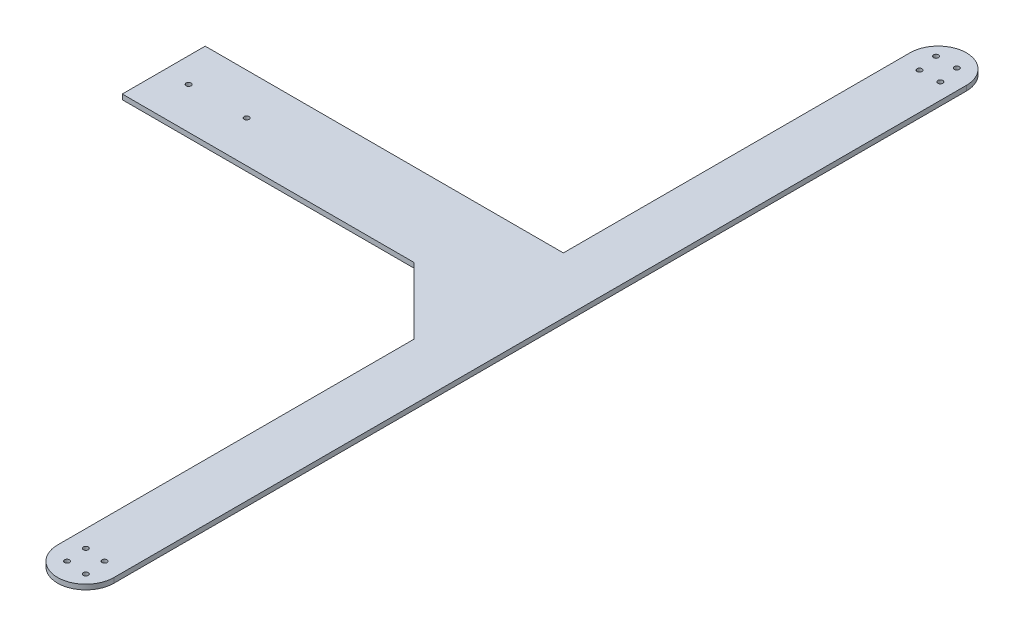
ISO-10303-21;
HEADER;
FILE_DESCRIPTION(('STEP AP214'),'2;1');
FILE_NAME('part.step','',(''),(''),'','','');
FILE_SCHEMA(('AUTOMOTIVE_DESIGN { 1 0 10303 214 1 1 1 1 }'));
ENDSEC;
DATA;
#1=APPLICATION_CONTEXT('core data for automotive mechanical design processes');
#2=APPLICATION_PROTOCOL_DEFINITION('international standard','automotive_design',2000,#1);
#3=PRODUCT_CONTEXT('',#1,'mechanical');
#4=PRODUCT('Part','Part','',(#3));
#5=PRODUCT_RELATED_PRODUCT_CATEGORY('part','',(#4));
#6=PRODUCT_DEFINITION_FORMATION('','',#4);
#7=PRODUCT_DEFINITION_CONTEXT('part definition',#1,'design');
#8=PRODUCT_DEFINITION('design','',#6,#7);
#9=PRODUCT_DEFINITION_SHAPE('','',#8);
#10=(LENGTH_UNIT() NAMED_UNIT(*) SI_UNIT(.MILLI.,.METRE.));
#11=(NAMED_UNIT(*) PLANE_ANGLE_UNIT() SI_UNIT($,.RADIAN.));
#12=(NAMED_UNIT(*) SI_UNIT($,.STERADIAN.) SOLID_ANGLE_UNIT());
#13=UNCERTAINTY_MEASURE_WITH_UNIT(LENGTH_MEASURE(1.E-05),#10,'distance_accuracy_value','');
#14=(GEOMETRIC_REPRESENTATION_CONTEXT(3) GLOBAL_UNCERTAINTY_ASSIGNED_CONTEXT((#13)) GLOBAL_UNIT_ASSIGNED_CONTEXT((#10,
#11,#12)) REPRESENTATION_CONTEXT('',''));
#15=CARTESIAN_POINT('',(0.,0.,0.));
#16=DIRECTION('',(0.,0.,1.));
#17=DIRECTION('',(1.,0.,0.));
#18=AXIS2_PLACEMENT_3D('',#15,#16,#17);
#19=CARTESIAN_POINT('',(233.,3.,-259.060301809058));
#20=DIRECTION('',(0.,-1.,0.));
#21=DIRECTION('',(0.,0.,-1.));
#22=AXIS2_PLACEMENT_3D('',#19,#20,#21);
#23=CYLINDRICAL_SURFACE('',#22,17.);
#24=CARTESIAN_POINT('',(233.,0.,-259.060301809058));
#25=DIRECTION('',(0.,1.,0.));
#26=DIRECTION('',(0.,0.,1.));
#27=AXIS2_PLACEMENT_3D('',#24,#25,#26);
#28=CIRCLE('',#27,17.);
#29=CARTESIAN_POINT('',(216.,0.,-259.060301809058));
#30=VERTEX_POINT('',#29);
#31=CARTESIAN_POINT('',(250.,0.,-259.060301809058));
#32=VERTEX_POINT('',#31);
#33=EDGE_CURVE('E165',#30,#32,#28,.F.);
#34=ORIENTED_EDGE('',*,*,#33,.F.);
#35=DIRECTION('',(0.,-1.,0.));
#36=VECTOR('',#35,1.);
#37=CARTESIAN_POINT('',(216.,3.,-259.060301809058));
#38=LINE('',#37,#36);
#39=CARTESIAN_POINT('',(216.,3.,-259.060301809058));
#40=VERTEX_POINT('',#39);
#41=EDGE_CURVE('E11',#40,#30,#38,.T.);
#42=ORIENTED_EDGE('',*,*,#41,.F.);
#43=CARTESIAN_POINT('',(233.,3.,-259.060301809058));
#44=DIRECTION('',(0.,1.,0.));
#45=DIRECTION('',(0.,0.,1.));
#46=AXIS2_PLACEMENT_3D('',#43,#44,#45);
#47=CIRCLE('',#46,17.);
#48=CARTESIAN_POINT('',(250.,3.,-259.060301809058));
#49=VERTEX_POINT('',#48);
#50=EDGE_CURVE('E503',#40,#49,#47,.F.);
#51=ORIENTED_EDGE('',*,*,#50,.T.);
#52=DIRECTION('',(0.,-1.,0.));
#53=VECTOR('',#52,1.);
#54=CARTESIAN_POINT('',(250.,3.,-259.060301809058));
#55=LINE('',#54,#53);
#56=EDGE_CURVE('E95',#49,#32,#55,.T.);
#57=ORIENTED_EDGE('',*,*,#56,.T.);
#58=EDGE_LOOP('',(#34,#42,#51,#57));
#59=FACE_BOUND('',#58,.T.);
#60=ADVANCED_FACE('F41',(#59),#23,.T.);
#61=CARTESIAN_POINT('',(216.,3.,0.));
#62=DIRECTION('',(-1.,0.,0.));
#63=DIRECTION('',(0.,0.,1.));
#64=AXIS2_PLACEMENT_3D('',#61,#62,#63);
#65=PLANE('',#64);
#66=DIRECTION('',(0.,0.,-1.));
#67=VECTOR('',#66,1.);
#68=CARTESIAN_POINT('',(216.,0.,0.));
#69=LINE('',#68,#67);
#70=CARTESIAN_POINT('',(216.,0.,-50.));
#71=VERTEX_POINT('',#70);
#72=EDGE_CURVE('E163',#71,#30,#69,.T.);
#73=ORIENTED_EDGE('',*,*,#72,.F.);
#74=DIRECTION('',(0.,-1.,0.));
#75=VECTOR('',#74,1.);
#76=CARTESIAN_POINT('',(216.,3.,-50.));
#77=LINE('',#76,#75);
#78=CARTESIAN_POINT('',(216.,3.,-50.));
#79=VERTEX_POINT('',#78);
#80=EDGE_CURVE('E50',#79,#71,#77,.T.);
#81=ORIENTED_EDGE('',*,*,#80,.F.);
#82=DIRECTION('',(0.,0.,-1.));
#83=VECTOR('',#82,1.);
#84=CARTESIAN_POINT('',(216.,3.,0.));
#85=LINE('',#84,#83);
#86=EDGE_CURVE('E499',#79,#40,#85,.T.);
#87=ORIENTED_EDGE('',*,*,#86,.T.);
#88=ORIENTED_EDGE('',*,*,#41,.T.);
#89=EDGE_LOOP('',(#73,#81,#87,#88));
#90=FACE_BOUND('',#89,.T.);
#91=ADVANCED_FACE('F164',(#90),#65,.T.);
#92=CARTESIAN_POINT('',(0.,3.,-50.));
#93=DIRECTION('',(0.,0.,-1.));
#94=DIRECTION('',(-1.,0.,0.));
#95=AXIS2_PLACEMENT_3D('',#92,#93,#94);
#96=PLANE('',#95);
#97=DIRECTION('',(1.,0.,0.));
#98=VECTOR('',#97,1.);
#99=CARTESIAN_POINT('',(0.,0.,-50.));
#100=LINE('',#99,#98);
#101=CARTESIAN_POINT('',(0.,0.,-50.));
#102=VERTEX_POINT('',#101);
#103=EDGE_CURVE('E155',#102,#71,#100,.T.);
#104=ORIENTED_EDGE('',*,*,#103,.F.);
#105=DIRECTION('',(0.,-1.,0.));
#106=VECTOR('',#105,1.);
#107=CARTESIAN_POINT('',(0.,3.,-50.));
#108=LINE('',#107,#106);
#109=CARTESIAN_POINT('',(0.,3.,-50.));
#110=VERTEX_POINT('',#109);
#111=EDGE_CURVE('E148',#110,#102,#108,.T.);
#112=ORIENTED_EDGE('',*,*,#111,.F.);
#113=DIRECTION('',(1.,0.,0.));
#114=VECTOR('',#113,1.);
#115=CARTESIAN_POINT('',(0.,3.,-50.));
#116=LINE('',#115,#114);
#117=EDGE_CURVE('E158',#110,#79,#116,.T.);
#118=ORIENTED_EDGE('',*,*,#117,.T.);
#119=ORIENTED_EDGE('',*,*,#80,.T.);
#120=EDGE_LOOP('',(#104,#112,#118,#119));
#121=FACE_BOUND('',#120,.T.);
#122=ADVANCED_FACE('F153',(#121),#96,.T.);
#123=CARTESIAN_POINT('',(0.,3.,0.));
#124=DIRECTION('',(-1.,0.,0.));
#125=DIRECTION('',(0.,0.,1.));
#126=AXIS2_PLACEMENT_3D('',#123,#124,#125);
#127=PLANE('',#126);
#128=DIRECTION('',(0.,0.,-1.));
#129=VECTOR('',#128,1.);
#130=CARTESIAN_POINT('',(0.,0.,0.));
#131=LINE('',#130,#129);
#132=CARTESIAN_POINT('',(0.,0.,0.));
#133=VERTEX_POINT('',#132);
#134=EDGE_CURVE('E170',#133,#102,#131,.T.);
#135=ORIENTED_EDGE('',*,*,#134,.F.);
#136=DIRECTION('',(0.,-1.,0.));
#137=VECTOR('',#136,1.);
#138=CARTESIAN_POINT('',(0.,3.,0.));
#139=LINE('',#138,#137);
#140=CARTESIAN_POINT('',(0.,3.,0.));
#141=VERTEX_POINT('',#140);
#142=EDGE_CURVE('E146',#141,#133,#139,.T.);
#143=ORIENTED_EDGE('',*,*,#142,.F.);
#144=DIRECTION('',(0.,0.,-1.));
#145=VECTOR('',#144,1.);
#146=CARTESIAN_POINT('',(0.,3.,0.));
#147=LINE('',#146,#145);
#148=EDGE_CURVE('E498',#141,#110,#147,.T.);
#149=ORIENTED_EDGE('',*,*,#148,.T.);
#150=ORIENTED_EDGE('',*,*,#111,.T.);
#151=EDGE_LOOP('',(#135,#143,#149,#150));
#152=FACE_BOUND('',#151,.T.);
#153=ADVANCED_FACE('F316',(#152),#127,.T.);
#154=CARTESIAN_POINT('',(0.,3.,0.));
#155=DIRECTION('',(0.,0.,-1.));
#156=DIRECTION('',(-1.,0.,0.));
#157=AXIS2_PLACEMENT_3D('',#154,#155,#156);
#158=PLANE('',#157);
#159=DIRECTION('',(1.,0.,0.));
#160=VECTOR('',#159,1.);
#161=CARTESIAN_POINT('',(0.,0.,0.));
#162=LINE('',#161,#160);
#163=CARTESIAN_POINT('',(176.,0.,0.));
#164=VERTEX_POINT('',#163);
#165=EDGE_CURVE('E172',#133,#164,#162,.T.);
#166=ORIENTED_EDGE('',*,*,#165,.T.);
#167=DIRECTION('',(0.,-1.,0.));
#168=VECTOR('',#167,1.);
#169=CARTESIAN_POINT('',(176.,3.,0.));
#170=LINE('',#169,#168);
#171=CARTESIAN_POINT('',(176.,3.,0.));
#172=VERTEX_POINT('',#171);
#173=EDGE_CURVE('E139',#172,#164,#170,.T.);
#174=ORIENTED_EDGE('',*,*,#173,.F.);
#175=DIRECTION('',(1.,0.,0.));
#176=VECTOR('',#175,1.);
#177=CARTESIAN_POINT('',(0.,3.,0.));
#178=LINE('',#177,#176);
#179=EDGE_CURVE('E501',#141,#172,#178,.T.);
#180=ORIENTED_EDGE('',*,*,#179,.F.);
#181=ORIENTED_EDGE('',*,*,#142,.T.);
#182=EDGE_LOOP('',(#166,#174,#180,#181));
#183=FACE_BOUND('',#182,.T.);
#184=ADVANCED_FACE('F312',(#183),#158,.F.);
#185=CARTESIAN_POINT('',(88.,3.,-88.));
#186=DIRECTION('',(0.707106781186547,0.,-0.707106781186547));
#187=DIRECTION('',(-0.707106781186548,0.,-0.707106781186548));
#188=AXIS2_PLACEMENT_3D('',#185,#186,#187);
#189=PLANE('',#188);
#190=DIRECTION('',(0.707106781186548,0.,0.707106781186548));
#191=VECTOR('',#190,1.);
#192=CARTESIAN_POINT('',(88.,0.,-88.));
#193=LINE('',#192,#191);
#194=CARTESIAN_POINT('',(216.,0.,40.));
#195=VERTEX_POINT('',#194);
#196=EDGE_CURVE('E178',#164,#195,#193,.T.);
#197=ORIENTED_EDGE('',*,*,#196,.T.);
#198=DIRECTION('',(0.,-1.,0.));
#199=VECTOR('',#198,1.);
#200=CARTESIAN_POINT('',(216.,3.,40.));
#201=LINE('',#200,#199);
#202=CARTESIAN_POINT('',(216.,3.,40.));
#203=VERTEX_POINT('',#202);
#204=EDGE_CURVE('E137',#203,#195,#201,.T.);
#205=ORIENTED_EDGE('',*,*,#204,.F.);
#206=DIRECTION('',(0.707106781186548,0.,0.707106781186548));
#207=VECTOR('',#206,1.);
#208=CARTESIAN_POINT('',(88.,3.,-88.));
#209=LINE('',#208,#207);
#210=EDGE_CURVE('E130',#172,#203,#209,.T.);
#211=ORIENTED_EDGE('',*,*,#210,.F.);
#212=ORIENTED_EDGE('',*,*,#173,.T.);
#213=EDGE_LOOP('',(#197,#205,#211,#212));
#214=FACE_BOUND('',#213,.T.);
#215=ADVANCED_FACE('F309',(#214),#189,.F.);
#216=CARTESIAN_POINT('',(216.,3.,0.));
#217=DIRECTION('',(1.,0.,0.));
#218=DIRECTION('',(0.,0.,-1.));
#219=AXIS2_PLACEMENT_3D('',#216,#217,#218);
#220=PLANE('',#219);
#221=DIRECTION('',(0.,0.,1.));
#222=VECTOR('',#221,1.);
#223=CARTESIAN_POINT('',(216.,0.,0.));
#224=LINE('',#223,#222);
#225=CARTESIAN_POINT('',(216.,0.,255.));
#226=VERTEX_POINT('',#225);
#227=EDGE_CURVE('E136',#195,#226,#224,.T.);
#228=ORIENTED_EDGE('',*,*,#227,.T.);
#229=DIRECTION('',(0.,-1.,0.));
#230=VECTOR('',#229,1.);
#231=CARTESIAN_POINT('',(216.,3.,255.));
#232=LINE('',#231,#230);
#233=CARTESIAN_POINT('',(216.,3.,255.));
#234=VERTEX_POINT('',#233);
#235=EDGE_CURVE('E122',#234,#226,#232,.T.);
#236=ORIENTED_EDGE('',*,*,#235,.F.);
#237=DIRECTION('',(0.,0.,1.));
#238=VECTOR('',#237,1.);
#239=CARTESIAN_POINT('',(216.,3.,0.));
#240=LINE('',#239,#238);
#241=EDGE_CURVE('E125',#203,#234,#240,.T.);
#242=ORIENTED_EDGE('',*,*,#241,.F.);
#243=ORIENTED_EDGE('',*,*,#204,.T.);
#244=EDGE_LOOP('',(#228,#236,#242,#243));
#245=FACE_BOUND('',#244,.T.);
#246=ADVANCED_FACE('F135',(#245),#220,.F.);
#247=CARTESIAN_POINT('',(233.,3.,255.));
#248=DIRECTION('',(0.,-1.,0.));
#249=DIRECTION('',(0.,0.,-1.));
#250=AXIS2_PLACEMENT_3D('',#247,#248,#249);
#251=CYLINDRICAL_SURFACE('',#250,17.);
#252=CARTESIAN_POINT('',(233.,0.,255.));
#253=DIRECTION('',(0.,1.,0.));
#254=DIRECTION('',(0.,0.,1.));
#255=AXIS2_PLACEMENT_3D('',#252,#253,#254);
#256=CIRCLE('',#255,17.);
#257=CARTESIAN_POINT('',(250.,0.,255.));
#258=VERTEX_POINT('',#257);
#259=EDGE_CURVE('E182',#226,#258,#256,.T.);
#260=ORIENTED_EDGE('',*,*,#259,.T.);
#261=DIRECTION('',(0.,-1.,0.));
#262=VECTOR('',#261,1.);
#263=CARTESIAN_POINT('',(250.,3.,255.));
#264=LINE('',#263,#262);
#265=CARTESIAN_POINT('',(250.,3.,255.));
#266=VERTEX_POINT('',#265);
#267=EDGE_CURVE('E124',#266,#258,#264,.T.);
#268=ORIENTED_EDGE('',*,*,#267,.F.);
#269=CARTESIAN_POINT('',(233.,3.,255.));
#270=DIRECTION('',(0.,1.,0.));
#271=DIRECTION('',(0.,0.,1.));
#272=AXIS2_PLACEMENT_3D('',#269,#270,#271);
#273=CIRCLE('',#272,17.);
#274=EDGE_CURVE('E117',#234,#266,#273,.T.);
#275=ORIENTED_EDGE('',*,*,#274,.F.);
#276=ORIENTED_EDGE('',*,*,#235,.T.);
#277=EDGE_LOOP('',(#260,#268,#275,#276));
#278=FACE_BOUND('',#277,.T.);
#279=ADVANCED_FACE('F120',(#278),#251,.T.);
#280=CARTESIAN_POINT('',(238.092169369031,3.,-265.230375643065));
#281=DIRECTION('',(0.,-1.,0.));
#282=DIRECTION('',(0.,0.,-1.));
#283=AXIS2_PLACEMENT_3D('',#280,#281,#282);
#284=CYLINDRICAL_SURFACE('',#283,1.5);
#285=CARTESIAN_POINT('',(238.092169369031,3.,-265.230375643065));
#286=DIRECTION('',(0.,1.,0.));
#287=DIRECTION('',(0.,0.,1.));
#288=AXIS2_PLACEMENT_3D('',#285,#286,#287);
#289=CIRCLE('',#288,1.5);
#290=CARTESIAN_POINT('',(238.092169369031,3.,-263.730375643065));
#291=VERTEX_POINT('',#290);
#292=EDGE_CURVE('E510',#291,#291,#289,.T.);
#293=ORIENTED_EDGE('',*,*,#292,.T.);
#294=EDGE_LOOP('',(#293));
#295=FACE_BOUND('',#294,.T.);
#296=CARTESIAN_POINT('',(238.092169369031,0.,-265.230375643065));
#297=DIRECTION('',(0.,1.,0.));
#298=DIRECTION('',(0.,0.,1.));
#299=AXIS2_PLACEMENT_3D('',#296,#297,#298);
#300=CIRCLE('',#299,1.5);
#301=CARTESIAN_POINT('',(238.092169369031,0.,-263.730375643065));
#302=VERTEX_POINT('',#301);
#303=EDGE_CURVE('E214',#302,#302,#300,.T.);
#304=ORIENTED_EDGE('',*,*,#303,.F.);
#305=EDGE_LOOP('',(#304));
#306=FACE_BOUND('',#305,.T.);
#307=ADVANCED_FACE('F224',(#295,#306),#284,.F.);
#308=CARTESIAN_POINT('',(225.673037322116,3.,-265.107252934781));
#309=DIRECTION('',(0.,-1.,0.));
#310=DIRECTION('',(0.,0.,-1.));
#311=AXIS2_PLACEMENT_3D('',#308,#309,#310);
#312=CYLINDRICAL_SURFACE('',#311,1.5);
#313=CARTESIAN_POINT('',(225.673037322116,3.,-265.107252934781));
#314=DIRECTION('',(0.,1.,0.));
#315=DIRECTION('',(0.,0.,1.));
#316=AXIS2_PLACEMENT_3D('',#313,#314,#315);
#317=CIRCLE('',#316,1.5);
#318=CARTESIAN_POINT('',(225.673037322116,3.,-263.607252934781));
#319=VERTEX_POINT('',#318);
#320=EDGE_CURVE('E513',#319,#319,#317,.T.);
#321=ORIENTED_EDGE('',*,*,#320,.T.);
#322=EDGE_LOOP('',(#321));
#323=FACE_BOUND('',#322,.T.);
#324=CARTESIAN_POINT('',(225.673037322116,0.,-265.107252934781));
#325=DIRECTION('',(0.,1.,0.));
#326=DIRECTION('',(0.,0.,1.));
#327=AXIS2_PLACEMENT_3D('',#324,#325,#326);
#328=CIRCLE('',#327,1.5);
#329=CARTESIAN_POINT('',(225.673037322116,0.,-263.607252934781));
#330=VERTEX_POINT('',#329);
#331=EDGE_CURVE('E211',#330,#330,#328,.T.);
#332=ORIENTED_EDGE('',*,*,#331,.F.);
#333=EDGE_LOOP('',(#332));
#334=FACE_BOUND('',#333,.T.);
#335=ADVANCED_FACE('F227',(#323,#334),#312,.F.);
#336=CARTESIAN_POINT('',(227.90783063097,3.,-252.89022797505));
#337=DIRECTION('',(0.,-1.,0.));
#338=DIRECTION('',(0.,0.,-1.));
#339=AXIS2_PLACEMENT_3D('',#336,#337,#338);
#340=CYLINDRICAL_SURFACE('',#339,1.5);
#341=CARTESIAN_POINT('',(227.90783063097,3.,-252.89022797505));
#342=DIRECTION('',(0.,1.,0.));
#343=DIRECTION('',(0.,0.,1.));
#344=AXIS2_PLACEMENT_3D('',#341,#342,#343);
#345=CIRCLE('',#344,1.5);
#346=CARTESIAN_POINT('',(227.90783063097,3.,-251.39022797505));
#347=VERTEX_POINT('',#346);
#348=EDGE_CURVE('E516',#347,#347,#345,.T.);
#349=ORIENTED_EDGE('',*,*,#348,.T.);
#350=EDGE_LOOP('',(#349));
#351=FACE_BOUND('',#350,.T.);
#352=CARTESIAN_POINT('',(227.90783063097,0.,-252.89022797505));
#353=DIRECTION('',(0.,1.,0.));
#354=DIRECTION('',(0.,0.,1.));
#355=AXIS2_PLACEMENT_3D('',#352,#353,#354);
#356=CIRCLE('',#355,1.5);
#357=CARTESIAN_POINT('',(227.90783063097,0.,-251.39022797505));
#358=VERTEX_POINT('',#357);
#359=EDGE_CURVE('E208',#358,#358,#356,.T.);
#360=ORIENTED_EDGE('',*,*,#359,.F.);
#361=EDGE_LOOP('',(#360));
#362=FACE_BOUND('',#361,.T.);
#363=ADVANCED_FACE('F231',(#351,#362),#340,.F.);
#364=CARTESIAN_POINT('',(240.326962677884,3.,-253.013350683334));
#365=DIRECTION('',(0.,-1.,0.));
#366=DIRECTION('',(0.,0.,-1.));
#367=AXIS2_PLACEMENT_3D('',#364,#365,#366);
#368=CYLINDRICAL_SURFACE('',#367,1.5);
#369=CARTESIAN_POINT('',(240.326962677884,3.,-253.013350683334));
#370=DIRECTION('',(0.,1.,0.));
#371=DIRECTION('',(0.,0.,1.));
#372=AXIS2_PLACEMENT_3D('',#369,#370,#371);
#373=CIRCLE('',#372,1.5);
#374=CARTESIAN_POINT('',(240.326962677884,3.,-251.513350683334));
#375=VERTEX_POINT('',#374);
#376=EDGE_CURVE('E519',#375,#375,#373,.T.);
#377=ORIENTED_EDGE('',*,*,#376,.T.);
#378=EDGE_LOOP('',(#377));
#379=FACE_BOUND('',#378,.T.);
#380=CARTESIAN_POINT('',(240.326962677884,0.,-253.013350683334));
#381=DIRECTION('',(0.,1.,0.));
#382=DIRECTION('',(0.,0.,1.));
#383=AXIS2_PLACEMENT_3D('',#380,#381,#382);
#384=CIRCLE('',#383,1.5);
#385=CARTESIAN_POINT('',(240.326962677884,0.,-251.513350683334));
#386=VERTEX_POINT('',#385);
#387=EDGE_CURVE('E205',#386,#386,#384,.T.);
#388=ORIENTED_EDGE('',*,*,#387,.F.);
#389=EDGE_LOOP('',(#388));
#390=FACE_BOUND('',#389,.T.);
#391=ADVANCED_FACE('F235',(#379,#390),#368,.F.);
#392=CARTESIAN_POINT('',(226.282485578728,3.,248.282485578728));
#393=DIRECTION('',(0.,-1.,0.));
#394=DIRECTION('',(0.,0.,-1.));
#395=AXIS2_PLACEMENT_3D('',#392,#393,#394);
#396=CYLINDRICAL_SURFACE('',#395,1.5);
#397=CARTESIAN_POINT('',(226.282485578728,3.,248.282485578728));
#398=DIRECTION('',(0.,1.,0.));
#399=DIRECTION('',(0.,0.,1.));
#400=AXIS2_PLACEMENT_3D('',#397,#398,#399);
#401=CIRCLE('',#400,1.5);
#402=CARTESIAN_POINT('',(226.282485578728,3.,249.782485578728));
#403=VERTEX_POINT('',#402);
#404=EDGE_CURVE('E522',#403,#403,#401,.T.);
#405=ORIENTED_EDGE('',*,*,#404,.T.);
#406=EDGE_LOOP('',(#405));
#407=FACE_BOUND('',#406,.T.);
#408=CARTESIAN_POINT('',(226.282485578728,0.,248.282485578728));
#409=DIRECTION('',(0.,1.,0.));
#410=DIRECTION('',(0.,0.,1.));
#411=AXIS2_PLACEMENT_3D('',#408,#409,#410);
#412=CIRCLE('',#411,1.5);
#413=CARTESIAN_POINT('',(226.282485578728,0.,249.782485578728));
#414=VERTEX_POINT('',#413);
#415=EDGE_CURVE('E202',#414,#414,#412,.T.);
#416=ORIENTED_EDGE('',*,*,#415,.F.);
#417=EDGE_LOOP('',(#416));
#418=FACE_BOUND('',#417,.T.);
#419=ADVANCED_FACE('F239',(#407,#418),#396,.F.);
#420=CARTESIAN_POINT('',(238.656854249492,3.,249.343145750508));
#421=DIRECTION('',(0.,-1.,0.));
#422=DIRECTION('',(0.,0.,-1.));
#423=AXIS2_PLACEMENT_3D('',#420,#421,#422);
#424=CYLINDRICAL_SURFACE('',#423,1.5);
#425=CARTESIAN_POINT('',(238.656854249492,3.,249.343145750508));
#426=DIRECTION('',(0.,1.,0.));
#427=DIRECTION('',(0.,0.,1.));
#428=AXIS2_PLACEMENT_3D('',#425,#426,#427);
#429=CIRCLE('',#428,1.5);
#430=CARTESIAN_POINT('',(238.656854249492,3.,250.843145750508));
#431=VERTEX_POINT('',#430);
#432=EDGE_CURVE('E525',#431,#431,#429,.T.);
#433=ORIENTED_EDGE('',*,*,#432,.T.);
#434=EDGE_LOOP('',(#433));
#435=FACE_BOUND('',#434,.T.);
#436=CARTESIAN_POINT('',(238.656854249492,0.,249.343145750508));
#437=DIRECTION('',(0.,1.,0.));
#438=DIRECTION('',(0.,0.,1.));
#439=AXIS2_PLACEMENT_3D('',#436,#437,#438);
#440=CIRCLE('',#439,1.5);
#441=CARTESIAN_POINT('',(238.656854249492,0.,250.843145750508));
#442=VERTEX_POINT('',#441);
#443=EDGE_CURVE('E199',#442,#442,#440,.T.);
#444=ORIENTED_EDGE('',*,*,#443,.F.);
#445=EDGE_LOOP('',(#444));
#446=FACE_BOUND('',#445,.T.);
#447=ADVANCED_FACE('F243',(#435,#446),#424,.F.);
#448=CARTESIAN_POINT('',(239.717514421272,3.,261.717514421272));
#449=DIRECTION('',(0.,-1.,0.));
#450=DIRECTION('',(0.,0.,-1.));
#451=AXIS2_PLACEMENT_3D('',#448,#449,#450);
#452=CYLINDRICAL_SURFACE('',#451,1.5);
#453=CARTESIAN_POINT('',(239.717514421272,3.,261.717514421272));
#454=DIRECTION('',(0.,1.,0.));
#455=DIRECTION('',(0.,0.,1.));
#456=AXIS2_PLACEMENT_3D('',#453,#454,#455);
#457=CIRCLE('',#456,1.5);
#458=CARTESIAN_POINT('',(239.717514421272,3.,263.217514421272));
#459=VERTEX_POINT('',#458);
#460=EDGE_CURVE('E528',#459,#459,#457,.T.);
#461=ORIENTED_EDGE('',*,*,#460,.T.);
#462=EDGE_LOOP('',(#461));
#463=FACE_BOUND('',#462,.T.);
#464=CARTESIAN_POINT('',(239.717514421272,0.,261.717514421272));
#465=DIRECTION('',(0.,1.,0.));
#466=DIRECTION('',(0.,0.,1.));
#467=AXIS2_PLACEMENT_3D('',#464,#465,#466);
#468=CIRCLE('',#467,1.5);
#469=CARTESIAN_POINT('',(239.717514421272,0.,263.217514421272));
#470=VERTEX_POINT('',#469);
#471=EDGE_CURVE('E196',#470,#470,#468,.T.);
#472=ORIENTED_EDGE('',*,*,#471,.F.);
#473=EDGE_LOOP('',(#472));
#474=FACE_BOUND('',#473,.T.);
#475=ADVANCED_FACE('F247',(#463,#474),#452,.F.);
#476=CARTESIAN_POINT('',(227.343145750508,3.,260.656854249492));
#477=DIRECTION('',(0.,-1.,0.));
#478=DIRECTION('',(0.,0.,-1.));
#479=AXIS2_PLACEMENT_3D('',#476,#477,#478);
#480=CYLINDRICAL_SURFACE('',#479,1.5);
#481=CARTESIAN_POINT('',(227.343145750508,3.,260.656854249492));
#482=DIRECTION('',(0.,1.,0.));
#483=DIRECTION('',(0.,0.,1.));
#484=AXIS2_PLACEMENT_3D('',#481,#482,#483);
#485=CIRCLE('',#484,1.5);
#486=CARTESIAN_POINT('',(227.343145750508,3.,262.156854249492));
#487=VERTEX_POINT('',#486);
#488=EDGE_CURVE('E531',#487,#487,#485,.T.);
#489=ORIENTED_EDGE('',*,*,#488,.T.);
#490=EDGE_LOOP('',(#489));
#491=FACE_BOUND('',#490,.T.);
#492=CARTESIAN_POINT('',(227.343145750508,0.,260.656854249492));
#493=DIRECTION('',(0.,1.,0.));
#494=DIRECTION('',(0.,0.,1.));
#495=AXIS2_PLACEMENT_3D('',#492,#493,#494);
#496=CIRCLE('',#495,1.5);
#497=CARTESIAN_POINT('',(227.343145750508,0.,262.156854249492));
#498=VERTEX_POINT('',#497);
#499=EDGE_CURVE('E193',#498,#498,#496,.T.);
#500=ORIENTED_EDGE('',*,*,#499,.F.);
#501=EDGE_LOOP('',(#500));
#502=FACE_BOUND('',#501,.T.);
#503=ADVANCED_FACE('F251',(#491,#502),#480,.F.);
#504=CARTESIAN_POINT('',(15.,3.,-25.));
#505=DIRECTION('',(0.,-1.,0.));
#506=DIRECTION('',(0.,0.,-1.));
#507=AXIS2_PLACEMENT_3D('',#504,#505,#506);
#508=CYLINDRICAL_SURFACE('',#507,1.5);
#509=CARTESIAN_POINT('',(15.,3.,-25.));
#510=DIRECTION('',(0.,1.,0.));
#511=DIRECTION('',(0.,0.,1.));
#512=AXIS2_PLACEMENT_3D('',#509,#510,#511);
#513=CIRCLE('',#512,1.5);
#514=CARTESIAN_POINT('',(15.,3.,-23.5));
#515=VERTEX_POINT('',#514);
#516=EDGE_CURVE('E266',#515,#515,#513,.T.);
#517=ORIENTED_EDGE('',*,*,#516,.T.);
#518=EDGE_LOOP('',(#517));
#519=FACE_BOUND('',#518,.T.);
#520=CARTESIAN_POINT('',(15.,0.,-25.));
#521=DIRECTION('',(0.,1.,0.));
#522=DIRECTION('',(0.,0.,1.));
#523=AXIS2_PLACEMENT_3D('',#520,#521,#522);
#524=CIRCLE('',#523,1.5);
#525=CARTESIAN_POINT('',(15.,0.,-23.5));
#526=VERTEX_POINT('',#525);
#527=EDGE_CURVE('E190',#526,#526,#524,.T.);
#528=ORIENTED_EDGE('',*,*,#527,.F.);
#529=EDGE_LOOP('',(#528));
#530=FACE_BOUND('',#529,.T.);
#531=ADVANCED_FACE('F254',(#519,#530),#508,.F.);
#532=CARTESIAN_POINT('',(50.,3.,-25.));
#533=DIRECTION('',(0.,-1.,0.));
#534=DIRECTION('',(0.,0.,-1.));
#535=AXIS2_PLACEMENT_3D('',#532,#533,#534);
#536=CYLINDRICAL_SURFACE('',#535,1.5);
#537=CARTESIAN_POINT('',(50.,3.,-25.));
#538=DIRECTION('',(0.,1.,0.));
#539=DIRECTION('',(0.,0.,1.));
#540=AXIS2_PLACEMENT_3D('',#537,#538,#539);
#541=CIRCLE('',#540,1.5);
#542=CARTESIAN_POINT('',(50.,3.,-23.5));
#543=VERTEX_POINT('',#542);
#544=EDGE_CURVE('E184',#543,#543,#541,.T.);
#545=ORIENTED_EDGE('',*,*,#544,.T.);
#546=EDGE_LOOP('',(#545));
#547=FACE_BOUND('',#546,.T.);
#548=CARTESIAN_POINT('',(50.,0.,-25.));
#549=DIRECTION('',(0.,1.,0.));
#550=DIRECTION('',(0.,0.,1.));
#551=AXIS2_PLACEMENT_3D('',#548,#549,#550);
#552=CIRCLE('',#551,1.5);
#553=CARTESIAN_POINT('',(50.,0.,-23.5));
#554=VERTEX_POINT('',#553);
#555=EDGE_CURVE('E187',#554,#554,#552,.T.);
#556=ORIENTED_EDGE('',*,*,#555,.F.);
#557=EDGE_LOOP('',(#556));
#558=FACE_BOUND('',#557,.T.);
#559=ADVANCED_FACE('F43',(#547,#558),#536,.F.);
#560=CARTESIAN_POINT('',(250.,3.,0.));
#561=DIRECTION('',(-1.,0.,0.));
#562=DIRECTION('',(0.,0.,1.));
#563=AXIS2_PLACEMENT_3D('',#560,#561,#562);
#564=PLANE('',#563);
#565=DIRECTION('',(0.,0.,-1.));
#566=VECTOR('',#565,1.);
#567=CARTESIAN_POINT('',(250.,0.,0.));
#568=LINE('',#567,#566);
#569=EDGE_CURVE('E88',#258,#32,#568,.T.);
#570=ORIENTED_EDGE('',*,*,#569,.T.);
#571=ORIENTED_EDGE('',*,*,#56,.F.);
#572=DIRECTION('',(0.,0.,-1.));
#573=VECTOR('',#572,1.);
#574=CARTESIAN_POINT('',(250.,3.,0.));
#575=LINE('',#574,#573);
#576=EDGE_CURVE('E58',#266,#49,#575,.T.);
#577=ORIENTED_EDGE('',*,*,#576,.F.);
#578=ORIENTED_EDGE('',*,*,#267,.T.);
#579=EDGE_LOOP('',(#570,#571,#577,#578));
#580=FACE_BOUND('',#579,.T.);
#581=ADVANCED_FACE('F261',(#580),#564,.F.);
#582=CARTESIAN_POINT('',(0.,3.,0.));
#583=DIRECTION('',(0.,1.,0.));
#584=DIRECTION('',(0.,0.,1.));
#585=AXIS2_PLACEMENT_3D('',#582,#583,#584);
#586=PLANE('',#585);
#587=ORIENTED_EDGE('',*,*,#544,.F.);
#588=EDGE_LOOP('',(#587));
#589=FACE_BOUND('',#588,.T.);
#590=ORIENTED_EDGE('',*,*,#516,.F.);
#591=EDGE_LOOP('',(#590));
#592=FACE_BOUND('',#591,.T.);
#593=ORIENTED_EDGE('',*,*,#488,.F.);
#594=EDGE_LOOP('',(#593));
#595=FACE_BOUND('',#594,.T.);
#596=ORIENTED_EDGE('',*,*,#460,.F.);
#597=EDGE_LOOP('',(#596));
#598=FACE_BOUND('',#597,.T.);
#599=ORIENTED_EDGE('',*,*,#432,.F.);
#600=EDGE_LOOP('',(#599));
#601=FACE_BOUND('',#600,.T.);
#602=ORIENTED_EDGE('',*,*,#404,.F.);
#603=EDGE_LOOP('',(#602));
#604=FACE_BOUND('',#603,.T.);
#605=ORIENTED_EDGE('',*,*,#376,.F.);
#606=EDGE_LOOP('',(#605));
#607=FACE_BOUND('',#606,.T.);
#608=ORIENTED_EDGE('',*,*,#348,.F.);
#609=EDGE_LOOP('',(#608));
#610=FACE_BOUND('',#609,.T.);
#611=ORIENTED_EDGE('',*,*,#320,.F.);
#612=EDGE_LOOP('',(#611));
#613=FACE_BOUND('',#612,.T.);
#614=ORIENTED_EDGE('',*,*,#292,.F.);
#615=EDGE_LOOP('',(#614));
#616=FACE_BOUND('',#615,.T.);
#617=ORIENTED_EDGE('',*,*,#50,.F.);
#618=ORIENTED_EDGE('',*,*,#86,.F.);
#619=ORIENTED_EDGE('',*,*,#117,.F.);
#620=ORIENTED_EDGE('',*,*,#148,.F.);
#621=ORIENTED_EDGE('',*,*,#179,.T.);
#622=ORIENTED_EDGE('',*,*,#210,.T.);
#623=ORIENTED_EDGE('',*,*,#241,.T.);
#624=ORIENTED_EDGE('',*,*,#274,.T.);
#625=ORIENTED_EDGE('',*,*,#576,.T.);
#626=EDGE_LOOP('',(#617,#618,#619,#620,#621,#622,#623,#624,#625));
#627=FACE_BOUND('',#626,.T.);
#628=ADVANCED_FACE('F128',(#589,#592,#595,#598,#601,#604,#607,#610,#613,#616,#627),#586,.T.);
#629=CARTESIAN_POINT('',(0.,0.,0.));
#630=DIRECTION('',(0.,1.,0.));
#631=DIRECTION('',(0.,0.,1.));
#632=AXIS2_PLACEMENT_3D('',#629,#630,#631);
#633=PLANE('',#632);
#634=ORIENTED_EDGE('',*,*,#555,.T.);
#635=EDGE_LOOP('',(#634));
#636=FACE_BOUND('',#635,.T.);
#637=ORIENTED_EDGE('',*,*,#527,.T.);
#638=EDGE_LOOP('',(#637));
#639=FACE_BOUND('',#638,.T.);
#640=ORIENTED_EDGE('',*,*,#499,.T.);
#641=EDGE_LOOP('',(#640));
#642=FACE_BOUND('',#641,.T.);
#643=ORIENTED_EDGE('',*,*,#471,.T.);
#644=EDGE_LOOP('',(#643));
#645=FACE_BOUND('',#644,.T.);
#646=ORIENTED_EDGE('',*,*,#443,.T.);
#647=EDGE_LOOP('',(#646));
#648=FACE_BOUND('',#647,.T.);
#649=ORIENTED_EDGE('',*,*,#415,.T.);
#650=EDGE_LOOP('',(#649));
#651=FACE_BOUND('',#650,.T.);
#652=ORIENTED_EDGE('',*,*,#387,.T.);
#653=EDGE_LOOP('',(#652));
#654=FACE_BOUND('',#653,.T.);
#655=ORIENTED_EDGE('',*,*,#359,.T.);
#656=EDGE_LOOP('',(#655));
#657=FACE_BOUND('',#656,.T.);
#658=ORIENTED_EDGE('',*,*,#331,.T.);
#659=EDGE_LOOP('',(#658));
#660=FACE_BOUND('',#659,.T.);
#661=ORIENTED_EDGE('',*,*,#303,.T.);
#662=EDGE_LOOP('',(#661));
#663=FACE_BOUND('',#662,.T.);
#664=ORIENTED_EDGE('',*,*,#33,.T.);
#665=ORIENTED_EDGE('',*,*,#569,.F.);
#666=ORIENTED_EDGE('',*,*,#259,.F.);
#667=ORIENTED_EDGE('',*,*,#227,.F.);
#668=ORIENTED_EDGE('',*,*,#196,.F.);
#669=ORIENTED_EDGE('',*,*,#165,.F.);
#670=ORIENTED_EDGE('',*,*,#134,.T.);
#671=ORIENTED_EDGE('',*,*,#103,.T.);
#672=ORIENTED_EDGE('',*,*,#72,.T.);
#673=EDGE_LOOP('',(#664,#665,#666,#667,#668,#669,#670,#671,#672));
#674=FACE_BOUND('',#673,.T.);
#675=ADVANCED_FACE('F167',(#636,#639,#642,#645,#648,#651,#654,#657,#660,#663,#674),#633,.F.);
#676=CLOSED_SHELL('',(#60,#91,#122,#153,#184,#215,#246,#279,#307,#335,#363,#391,#419,#447,#475,
#503,#531,#559,#581,#628,#675));
#677=MANIFOLD_SOLID_BREP('B2',#676);
#678=ADVANCED_BREP_SHAPE_REPRESENTATION('',(#18,#677),#14);
#679=SHAPE_DEFINITION_REPRESENTATION(#9,#678);
ENDSEC;
END-ISO-10303-21;
